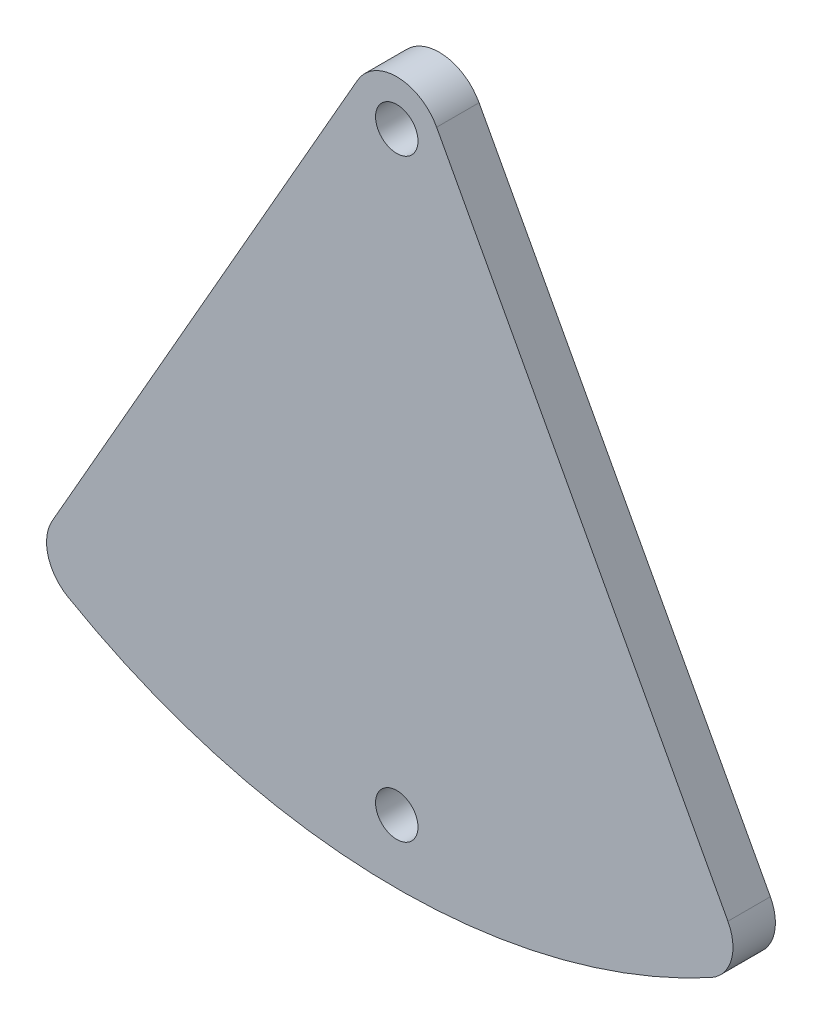
ISO-10303-21;
HEADER;
FILE_DESCRIPTION(('STEP AP214'),'2;1');
FILE_NAME('part.step','',(''),(''),'','','');
FILE_SCHEMA(('AUTOMOTIVE_DESIGN { 1 0 10303 214 1 1 1 1 }'));
ENDSEC;
DATA;
#1=APPLICATION_CONTEXT('core data for automotive mechanical design processes');
#2=APPLICATION_PROTOCOL_DEFINITION('international standard','automotive_design',2000,#1);
#3=PRODUCT_CONTEXT('',#1,'mechanical');
#4=PRODUCT('Part','Part','',(#3));
#5=PRODUCT_RELATED_PRODUCT_CATEGORY('part','',(#4));
#6=PRODUCT_DEFINITION_FORMATION('','',#4);
#7=PRODUCT_DEFINITION_CONTEXT('part definition',#1,'design');
#8=PRODUCT_DEFINITION('design','',#6,#7);
#9=PRODUCT_DEFINITION_SHAPE('','',#8);
#10=(LENGTH_UNIT() NAMED_UNIT(*) SI_UNIT(.MILLI.,.METRE.));
#11=(NAMED_UNIT(*) PLANE_ANGLE_UNIT() SI_UNIT($,.RADIAN.));
#12=(NAMED_UNIT(*) SI_UNIT($,.STERADIAN.) SOLID_ANGLE_UNIT());
#13=UNCERTAINTY_MEASURE_WITH_UNIT(LENGTH_MEASURE(1.E-05),#10,'distance_accuracy_value','');
#14=(GEOMETRIC_REPRESENTATION_CONTEXT(3) GLOBAL_UNCERTAINTY_ASSIGNED_CONTEXT((#13)) GLOBAL_UNIT_ASSIGNED_CONTEXT((#10,
#11,#12)) REPRESENTATION_CONTEXT('',''));
#15=CARTESIAN_POINT('',(0.,0.,0.));
#16=DIRECTION('',(0.,0.,1.));
#17=DIRECTION('',(1.,0.,0.));
#18=AXIS2_PLACEMENT_3D('',#15,#16,#17);
#19=CARTESIAN_POINT('',(0.,100.,5.));
#20=DIRECTION('',(0.,0.,1.));
#21=DIRECTION('',(1.,0.,0.));
#22=AXIS2_PLACEMENT_3D('',#19,#20,#21);
#23=PLANE('',#22);
#24=CARTESIAN_POINT('',(0.,100.,5.));
#25=DIRECTION('',(0.,0.,1.));
#26=DIRECTION('',(1.,0.,0.));
#27=AXIS2_PLACEMENT_3D('',#24,#25,#26);
#28=CIRCLE('',#27,5.);
#29=CARTESIAN_POINT('',(5.,100.,5.));
#30=VERTEX_POINT('',#29);
#31=EDGE_CURVE('E128',#30,#30,#28,.T.);
#32=ORIENTED_EDGE('',*,*,#31,.F.);
#33=EDGE_LOOP('',(#32));
#34=FACE_BOUND('',#33,.T.);
#35=CARTESIAN_POINT('',(0.,100.,5.));
#36=DIRECTION('',(0.,0.,1.));
#37=DIRECTION('',(1.,0.,0.));
#38=AXIS2_PLACEMENT_3D('',#35,#36,#37);
#39=CIRCLE('',#38,10.6688888457301);
#40=CARTESIAN_POINT('',(9.397696335695,105.050593310158,5.));
#41=VERTEX_POINT('',#40);
#42=CARTESIAN_POINT('',(-9.26304694401074,105.293500780731,5.));
#43=VERTEX_POINT('',#42);
#44=EDGE_CURVE('E135',#41,#43,#39,.T.);
#45=ORIENTED_EDGE('',*,*,#44,.T.);
#46=DIRECTION('',(-0.496162333048329,-0.868229773311212,0.));
#47=VECTOR('',#46,1.);
#48=CARTESIAN_POINT('',(-9.26304694401074,105.293500780731,5.));
#49=LINE('',#48,#47);
#50=CARTESIAN_POINT('',(-81.205819752206,-20.5984768365124,5.));
#51=VERTEX_POINT('',#50);
#52=EDGE_CURVE('E93',#43,#51,#49,.T.);
#53=ORIENTED_EDGE('',*,*,#52,.T.);
#54=CARTESIAN_POINT('',(-72.5235220190939,-25.5601001669957,5.));
#55=DIRECTION('',(0.,0.,1.));
#56=DIRECTION('',(1.,0.,0.));
#57=AXIS2_PLACEMENT_3D('',#54,#55,#56);
#58=CIRCLE('',#57,10.);
#59=CARTESIAN_POINT('',(-77.5251442273073,-34.219417419892,5.));
#60=VERTEX_POINT('',#59);
#61=EDGE_CURVE('E106',#51,#60,#58,.T.);
#62=ORIENTED_EDGE('',*,*,#61,.T.);
#63=CARTESIAN_POINT('',(0.,100.,5.));
#64=DIRECTION('',(0.,0.,1.));
#65=DIRECTION('',(1.,0.,0.));
#66=AXIS2_PLACEMENT_3D('',#63,#64,#65);
#67=CIRCLE('',#66,155.);
#68=CARTESIAN_POINT('',(74.0051918697429,-36.1918924764706,5.));
#69=VERTEX_POINT('',#68);
#70=EDGE_CURVE('E100',#60,#69,#67,.T.);
#71=ORIENTED_EDGE('',*,*,#70,.T.);
#72=CARTESIAN_POINT('',(69.2306633620176,-27.4053187683112,5.));
#73=DIRECTION('',(0.,0.,1.));
#74=DIRECTION('',(-1.,0.,0.));
#75=AXIS2_PLACEMENT_3D('',#72,#73,#74);
#76=CIRCLE('',#75,10.);
#77=CARTESIAN_POINT('',(78.0391686071127,-22.6713737594278,5.));
#78=VERTEX_POINT('',#77);
#79=EDGE_CURVE('E104',#69,#78,#76,.T.);
#80=ORIENTED_EDGE('',*,*,#79,.T.);
#81=DIRECTION('',(-0.47339450088834,0.880850524509511,0.));
#82=VECTOR('',#81,1.);
#83=CARTESIAN_POINT('',(9.397696335695,105.050593310158,5.));
#84=LINE('',#83,#82);
#85=EDGE_CURVE('E56',#78,#41,#84,.T.);
#86=ORIENTED_EDGE('',*,*,#85,.T.);
#87=EDGE_LOOP('',(#45,#53,#62,#71,#80,#86));
#88=FACE_BOUND('',#87,.T.);
#89=CARTESIAN_POINT('',(0.,-40.,5.));
#90=DIRECTION('',(0.,0.,1.));
#91=DIRECTION('',(1.,0.,0.));
#92=AXIS2_PLACEMENT_3D('',#89,#90,#91);
#93=CIRCLE('',#92,5.);
#94=CARTESIAN_POINT('',(5.,-40.,5.));
#95=VERTEX_POINT('',#94);
#96=EDGE_CURVE('E177',#95,#95,#93,.T.);
#97=ORIENTED_EDGE('',*,*,#96,.F.);
#98=EDGE_LOOP('',(#97));
#99=FACE_BOUND('',#98,.T.);
#100=ADVANCED_FACE('F39',(#34,#88,#99),#23,.T.);
#101=CARTESIAN_POINT('',(0.,100.,-5.));
#102=DIRECTION('',(0.,0.,1.));
#103=DIRECTION('',(1.,0.,0.));
#104=AXIS2_PLACEMENT_3D('',#101,#102,#103);
#105=PLANE('',#104);
#106=CARTESIAN_POINT('',(0.,100.,-5.));
#107=DIRECTION('',(0.,0.,1.));
#108=DIRECTION('',(1.,0.,0.));
#109=AXIS2_PLACEMENT_3D('',#106,#107,#108);
#110=CIRCLE('',#109,10.6688888457301);
#111=CARTESIAN_POINT('',(9.397696335695,105.050593310158,-5.));
#112=VERTEX_POINT('',#111);
#113=CARTESIAN_POINT('',(-9.26304694401074,105.293500780731,-5.));
#114=VERTEX_POINT('',#113);
#115=EDGE_CURVE('E124',#112,#114,#110,.T.);
#116=ORIENTED_EDGE('',*,*,#115,.F.);
#117=DIRECTION('',(-0.47339450088834,0.880850524509511,0.));
#118=VECTOR('',#117,1.);
#119=CARTESIAN_POINT('',(9.397696335695,105.050593310158,-5.));
#120=LINE('',#119,#118);
#121=CARTESIAN_POINT('',(78.0391686071127,-22.6713737594278,-5.));
#122=VERTEX_POINT('',#121);
#123=EDGE_CURVE('E85',#122,#112,#120,.T.);
#124=ORIENTED_EDGE('',*,*,#123,.F.);
#125=CARTESIAN_POINT('',(69.2306633620176,-27.4053187683112,-5.));
#126=DIRECTION('',(0.,0.,1.));
#127=DIRECTION('',(-1.,0.,0.));
#128=AXIS2_PLACEMENT_3D('',#125,#126,#127);
#129=CIRCLE('',#128,10.);
#130=CARTESIAN_POINT('',(74.0051918697429,-36.1918924764706,-5.));
#131=VERTEX_POINT('',#130);
#132=EDGE_CURVE('E79',#131,#122,#129,.T.);
#133=ORIENTED_EDGE('',*,*,#132,.F.);
#134=CARTESIAN_POINT('',(0.,100.,-5.));
#135=DIRECTION('',(0.,0.,1.));
#136=DIRECTION('',(1.,0.,0.));
#137=AXIS2_PLACEMENT_3D('',#134,#135,#136);
#138=CIRCLE('',#137,155.);
#139=CARTESIAN_POINT('',(-77.5251442273073,-34.219417419892,-5.));
#140=VERTEX_POINT('',#139);
#141=EDGE_CURVE('E114',#140,#131,#138,.T.);
#142=ORIENTED_EDGE('',*,*,#141,.F.);
#143=CARTESIAN_POINT('',(-72.5235220190939,-25.5601001669957,-5.));
#144=DIRECTION('',(0.,0.,1.));
#145=DIRECTION('',(1.,0.,0.));
#146=AXIS2_PLACEMENT_3D('',#143,#144,#145);
#147=CIRCLE('',#146,10.);
#148=CARTESIAN_POINT('',(-81.205819752206,-20.5984768365124,-5.));
#149=VERTEX_POINT('',#148);
#150=EDGE_CURVE('E130',#149,#140,#147,.T.);
#151=ORIENTED_EDGE('',*,*,#150,.F.);
#152=DIRECTION('',(-0.496162333048329,-0.868229773311212,0.));
#153=VECTOR('',#152,1.);
#154=CARTESIAN_POINT('',(-9.26304694401074,105.293500780731,-5.));
#155=LINE('',#154,#153);
#156=EDGE_CURVE('E127',#114,#149,#155,.T.);
#157=ORIENTED_EDGE('',*,*,#156,.F.);
#158=EDGE_LOOP('',(#116,#124,#133,#142,#151,#157));
#159=FACE_BOUND('',#158,.T.);
#160=CARTESIAN_POINT('',(0.,100.,-5.));
#161=DIRECTION('',(0.,0.,1.));
#162=DIRECTION('',(1.,0.,0.));
#163=AXIS2_PLACEMENT_3D('',#160,#161,#162);
#164=CIRCLE('',#163,5.);
#165=CARTESIAN_POINT('',(5.,100.,-5.));
#166=VERTEX_POINT('',#165);
#167=EDGE_CURVE('E183',#166,#166,#164,.T.);
#168=ORIENTED_EDGE('',*,*,#167,.T.);
#169=EDGE_LOOP('',(#168));
#170=FACE_BOUND('',#169,.T.);
#171=CARTESIAN_POINT('',(0.,-40.,-5.));
#172=DIRECTION('',(0.,0.,1.));
#173=DIRECTION('',(1.,0.,0.));
#174=AXIS2_PLACEMENT_3D('',#171,#172,#173);
#175=CIRCLE('',#174,5.);
#176=CARTESIAN_POINT('',(5.,-40.,-5.));
#177=VERTEX_POINT('',#176);
#178=EDGE_CURVE('E180',#177,#177,#175,.T.);
#179=ORIENTED_EDGE('',*,*,#178,.T.);
#180=EDGE_LOOP('',(#179));
#181=FACE_BOUND('',#180,.T.);
#182=ADVANCED_FACE('F144',(#159,#170,#181),#105,.F.);
#183=CARTESIAN_POINT('',(0.,100.,5.));
#184=DIRECTION('',(0.,0.,-1.));
#185=DIRECTION('',(-1.,0.,0.));
#186=AXIS2_PLACEMENT_3D('',#183,#184,#185);
#187=CYLINDRICAL_SURFACE('',#186,10.6688888457301);
#188=ORIENTED_EDGE('',*,*,#115,.T.);
#189=DIRECTION('',(0.,0.,-1.));
#190=VECTOR('',#189,1.);
#191=CARTESIAN_POINT('',(-9.26304694401074,105.293500780731,5.));
#192=LINE('',#191,#190);
#193=EDGE_CURVE('E11',#43,#114,#192,.T.);
#194=ORIENTED_EDGE('',*,*,#193,.F.);
#195=ORIENTED_EDGE('',*,*,#44,.F.);
#196=DIRECTION('',(0.,0.,-1.));
#197=VECTOR('',#196,1.);
#198=CARTESIAN_POINT('',(9.397696335695,105.050593310158,5.));
#199=LINE('',#198,#197);
#200=EDGE_CURVE('E120',#41,#112,#199,.T.);
#201=ORIENTED_EDGE('',*,*,#200,.T.);
#202=EDGE_LOOP('',(#188,#194,#195,#201));
#203=FACE_BOUND('',#202,.T.);
#204=ADVANCED_FACE('F41',(#203),#187,.T.);
#205=CARTESIAN_POINT('',(-9.26304694401074,105.293500780731,5.));
#206=DIRECTION('',(0.868229773311212,-0.496162333048329,0.));
#207=DIRECTION('',(0.496162333048329,0.868229773311212,0.));
#208=AXIS2_PLACEMENT_3D('',#205,#206,#207);
#209=PLANE('',#208);
#210=ORIENTED_EDGE('',*,*,#156,.T.);
#211=DIRECTION('',(0.,0.,-1.));
#212=VECTOR('',#211,1.);
#213=CARTESIAN_POINT('',(-81.205819752206,-20.5984768365124,5.));
#214=LINE('',#213,#212);
#215=EDGE_CURVE('E48',#51,#149,#214,.T.);
#216=ORIENTED_EDGE('',*,*,#215,.F.);
#217=ORIENTED_EDGE('',*,*,#52,.F.);
#218=ORIENTED_EDGE('',*,*,#193,.T.);
#219=EDGE_LOOP('',(#210,#216,#217,#218));
#220=FACE_BOUND('',#219,.T.);
#221=ADVANCED_FACE('F220',(#220),#209,.F.);
#222=CARTESIAN_POINT('',(-72.5235220190939,-25.5601001669957,5.));
#223=DIRECTION('',(0.,0.,-1.));
#224=DIRECTION('',(-1.,0.,0.));
#225=AXIS2_PLACEMENT_3D('',#222,#223,#224);
#226=CYLINDRICAL_SURFACE('',#225,10.);
#227=ORIENTED_EDGE('',*,*,#150,.T.);
#228=DIRECTION('',(0.,0.,-1.));
#229=VECTOR('',#228,1.);
#230=CARTESIAN_POINT('',(-77.5251442273073,-34.219417419892,5.));
#231=LINE('',#230,#229);
#232=EDGE_CURVE('E115',#60,#140,#231,.T.);
#233=ORIENTED_EDGE('',*,*,#232,.F.);
#234=ORIENTED_EDGE('',*,*,#61,.F.);
#235=ORIENTED_EDGE('',*,*,#215,.T.);
#236=EDGE_LOOP('',(#227,#233,#234,#235));
#237=FACE_BOUND('',#236,.T.);
#238=ADVANCED_FACE('F141',(#237),#226,.T.);
#239=CARTESIAN_POINT('',(0.,100.,5.));
#240=DIRECTION('',(0.,0.,-1.));
#241=DIRECTION('',(-1.,0.,0.));
#242=AXIS2_PLACEMENT_3D('',#239,#240,#241);
#243=CYLINDRICAL_SURFACE('',#242,155.);
#244=ORIENTED_EDGE('',*,*,#141,.T.);
#245=DIRECTION('',(0.,0.,-1.));
#246=VECTOR('',#245,1.);
#247=CARTESIAN_POINT('',(74.0051918697429,-36.1918924764706,5.));
#248=LINE('',#247,#246);
#249=EDGE_CURVE('E111',#69,#131,#248,.T.);
#250=ORIENTED_EDGE('',*,*,#249,.F.);
#251=ORIENTED_EDGE('',*,*,#70,.F.);
#252=ORIENTED_EDGE('',*,*,#232,.T.);
#253=EDGE_LOOP('',(#244,#250,#251,#252));
#254=FACE_BOUND('',#253,.T.);
#255=ADVANCED_FACE('F112',(#254),#243,.T.);
#256=CARTESIAN_POINT('',(69.2306633620176,-27.4053187683112,5.));
#257=DIRECTION('',(0.,0.,-1.));
#258=DIRECTION('',(-1.,0.,0.));
#259=AXIS2_PLACEMENT_3D('',#256,#257,#258);
#260=CYLINDRICAL_SURFACE('',#259,10.);
#261=ORIENTED_EDGE('',*,*,#132,.T.);
#262=DIRECTION('',(0.,0.,-1.));
#263=VECTOR('',#262,1.);
#264=CARTESIAN_POINT('',(78.0391686071127,-22.6713737594278,5.));
#265=LINE('',#264,#263);
#266=EDGE_CURVE('E116',#78,#122,#265,.T.);
#267=ORIENTED_EDGE('',*,*,#266,.F.);
#268=ORIENTED_EDGE('',*,*,#79,.F.);
#269=ORIENTED_EDGE('',*,*,#249,.T.);
#270=EDGE_LOOP('',(#261,#267,#268,#269));
#271=FACE_BOUND('',#270,.T.);
#272=ADVANCED_FACE('F118',(#271),#260,.T.);
#273=CARTESIAN_POINT('',(9.397696335695,105.050593310158,5.));
#274=DIRECTION('',(-0.880850524509511,-0.47339450088834,0.));
#275=DIRECTION('',(0.473394500888339,-0.880850524509511,0.));
#276=AXIS2_PLACEMENT_3D('',#273,#274,#275);
#277=PLANE('',#276);
#278=ORIENTED_EDGE('',*,*,#123,.T.);
#279=ORIENTED_EDGE('',*,*,#200,.F.);
#280=ORIENTED_EDGE('',*,*,#85,.F.);
#281=ORIENTED_EDGE('',*,*,#266,.T.);
#282=EDGE_LOOP('',(#278,#279,#280,#281));
#283=FACE_BOUND('',#282,.T.);
#284=ADVANCED_FACE('F149',(#283),#277,.F.);
#285=CARTESIAN_POINT('',(0.,100.,5.));
#286=DIRECTION('',(0.,0.,-1.));
#287=DIRECTION('',(-1.,0.,0.));
#288=AXIS2_PLACEMENT_3D('',#285,#286,#287);
#289=CYLINDRICAL_SURFACE('',#288,5.);
#290=ORIENTED_EDGE('',*,*,#31,.T.);
#291=EDGE_LOOP('',(#290));
#292=FACE_BOUND('',#291,.T.);
#293=ORIENTED_EDGE('',*,*,#167,.F.);
#294=EDGE_LOOP('',(#293));
#295=FACE_BOUND('',#294,.T.);
#296=ADVANCED_FACE('F151',(#292,#295),#289,.F.);
#297=CARTESIAN_POINT('',(0.,-40.,5.));
#298=DIRECTION('',(0.,0.,-1.));
#299=DIRECTION('',(-1.,0.,0.));
#300=AXIS2_PLACEMENT_3D('',#297,#298,#299);
#301=CYLINDRICAL_SURFACE('',#300,5.);
#302=ORIENTED_EDGE('',*,*,#96,.T.);
#303=EDGE_LOOP('',(#302));
#304=FACE_BOUND('',#303,.T.);
#305=ORIENTED_EDGE('',*,*,#178,.F.);
#306=EDGE_LOOP('',(#305));
#307=FACE_BOUND('',#306,.T.);
#308=ADVANCED_FACE('F157',(#304,#307),#301,.F.);
#309=CLOSED_SHELL('',(#100,#182,#204,#221,#238,#255,#272,#284,#296,#308));
#310=MANIFOLD_SOLID_BREP('B2',#309);
#311=ADVANCED_BREP_SHAPE_REPRESENTATION('',(#18,#310),#14);
#312=SHAPE_DEFINITION_REPRESENTATION(#9,#311);
ENDSEC;
END-ISO-10303-21;
